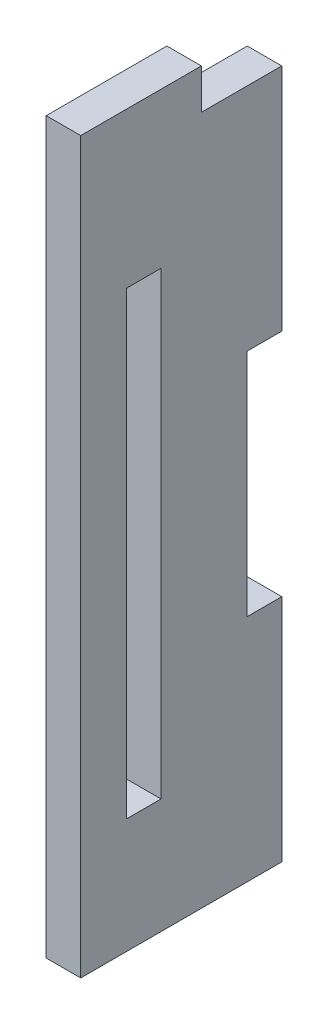
ISO-10303-21;
HEADER;
FILE_DESCRIPTION(('STEP AP214'),'2;1');
FILE_NAME('part.step','',(''),(''),'','','');
FILE_SCHEMA(('AUTOMOTIVE_DESIGN { 1 0 10303 214 1 1 1 1 }'));
ENDSEC;
DATA;
#1=APPLICATION_CONTEXT('core data for automotive mechanical design processes');
#2=APPLICATION_PROTOCOL_DEFINITION('international standard','automotive_design',2000,#1);
#3=PRODUCT_CONTEXT('',#1,'mechanical');
#4=PRODUCT('Part','Part','',(#3));
#5=PRODUCT_RELATED_PRODUCT_CATEGORY('part','',(#4));
#6=PRODUCT_DEFINITION_FORMATION('','',#4);
#7=PRODUCT_DEFINITION_CONTEXT('part definition',#1,'design');
#8=PRODUCT_DEFINITION('design','',#6,#7);
#9=PRODUCT_DEFINITION_SHAPE('','',#8);
#10=(LENGTH_UNIT() NAMED_UNIT(*) SI_UNIT(.MILLI.,.METRE.));
#11=(NAMED_UNIT(*) PLANE_ANGLE_UNIT() SI_UNIT($,.RADIAN.));
#12=(NAMED_UNIT(*) SI_UNIT($,.STERADIAN.) SOLID_ANGLE_UNIT());
#13=UNCERTAINTY_MEASURE_WITH_UNIT(LENGTH_MEASURE(1.E-05),#10,'distance_accuracy_value','');
#14=(GEOMETRIC_REPRESENTATION_CONTEXT(3) GLOBAL_UNCERTAINTY_ASSIGNED_CONTEXT((#13)) GLOBAL_UNIT_ASSIGNED_CONTEXT((#10,
#11,#12)) REPRESENTATION_CONTEXT('',''));
#15=CARTESIAN_POINT('',(0.,0.,0.));
#16=DIRECTION('',(0.,0.,1.));
#17=DIRECTION('',(1.,0.,0.));
#18=AXIS2_PLACEMENT_3D('',#15,#16,#17);
#19=CARTESIAN_POINT('',(6.,120.,0.));
#20=DIRECTION('',(0.,-1.,0.));
#21=DIRECTION('',(0.,0.,-1.));
#22=AXIS2_PLACEMENT_3D('',#19,#20,#21);
#23=PLANE('',#22);
#24=DIRECTION('',(-1.,0.,0.));
#25=VECTOR('',#24,1.);
#26=CARTESIAN_POINT('',(6.,120.,-21.));
#27=LINE('',#26,#25);
#28=CARTESIAN_POINT('',(6.,120.,-21.));
#29=VERTEX_POINT('',#28);
#30=CARTESIAN_POINT('',(0.,120.,-21.));
#31=VERTEX_POINT('',#30);
#32=EDGE_CURVE('E48',#29,#31,#27,.T.);
#33=ORIENTED_EDGE('',*,*,#32,.F.);
#34=DIRECTION('',(0.,0.,1.));
#35=VECTOR('',#34,1.);
#36=CARTESIAN_POINT('',(6.,120.,0.));
#37=LINE('',#36,#35);
#38=CARTESIAN_POINT('',(6.,120.,-35.));
#39=VERTEX_POINT('',#38);
#40=EDGE_CURVE('E144',#39,#29,#37,.T.);
#41=ORIENTED_EDGE('',*,*,#40,.F.);
#42=DIRECTION('',(-1.,0.,0.));
#43=VECTOR('',#42,1.);
#44=CARTESIAN_POINT('',(6.,120.,-35.));
#45=LINE('',#44,#43);
#46=CARTESIAN_POINT('',(0.,120.,-35.));
#47=VERTEX_POINT('',#46);
#48=EDGE_CURVE('E229',#39,#47,#45,.T.);
#49=ORIENTED_EDGE('',*,*,#48,.T.);
#50=DIRECTION('',(0.,0.,1.));
#51=VECTOR('',#50,1.);
#52=CARTESIAN_POINT('',(0.,120.,0.));
#53=LINE('',#52,#51);
#54=EDGE_CURVE('E222',#47,#31,#53,.T.);
#55=ORIENTED_EDGE('',*,*,#54,.T.);
#56=EDGE_LOOP('',(#33,#41,#49,#55));
#57=FACE_BOUND('',#56,.T.);
#58=ADVANCED_FACE('F33',(#57),#23,.F.);
#59=CARTESIAN_POINT('',(6.,0.,0.));
#60=DIRECTION('',(-1.,0.,0.));
#61=DIRECTION('',(0.,0.,1.));
#62=AXIS2_PLACEMENT_3D('',#59,#60,#61);
#63=PLANE('',#62);
#64=DIRECTION('',(0.,0.,1.));
#65=VECTOR('',#64,1.);
#66=CARTESIAN_POINT('',(6.,80.01,-35.));
#67=LINE('',#66,#65);
#68=CARTESIAN_POINT('',(6.,80.01,-35.));
#69=VERTEX_POINT('',#68);
#70=CARTESIAN_POINT('',(6.,80.01,-28.98));
#71=VERTEX_POINT('',#70);
#72=EDGE_CURVE('E195',#69,#71,#67,.T.);
#73=ORIENTED_EDGE('',*,*,#72,.F.);
#74=DIRECTION('',(0.,1.,0.));
#75=VECTOR('',#74,1.);
#76=CARTESIAN_POINT('',(6.,0.,-35.));
#77=LINE('',#76,#75);
#78=EDGE_CURVE('E224',#69,#39,#77,.T.);
#79=ORIENTED_EDGE('',*,*,#78,.T.);
#80=ORIENTED_EDGE('',*,*,#40,.T.);
#81=DIRECTION('',(0.,1.,0.));
#82=VECTOR('',#81,1.);
#83=CARTESIAN_POINT('',(6.,120.,-21.));
#84=LINE('',#83,#82);
#85=CARTESIAN_POINT('',(6.,127.,-21.));
#86=VERTEX_POINT('',#85);
#87=EDGE_CURVE('E135',#29,#86,#84,.T.);
#88=ORIENTED_EDGE('',*,*,#87,.T.);
#89=DIRECTION('',(0.,0.,1.));
#90=VECTOR('',#89,1.);
#91=CARTESIAN_POINT('',(6.,127.,0.));
#92=LINE('',#91,#90);
#93=CARTESIAN_POINT('',(6.,127.,0.));
#94=VERTEX_POINT('',#93);
#95=EDGE_CURVE('E142',#86,#94,#92,.T.);
#96=ORIENTED_EDGE('',*,*,#95,.T.);
#97=DIRECTION('',(0.,-1.,0.));
#98=VECTOR('',#97,1.);
#99=CARTESIAN_POINT('',(6.,0.,0.));
#100=LINE('',#99,#98);
#101=CARTESIAN_POINT('',(6.,0.,0.));
#102=VERTEX_POINT('',#101);
#103=EDGE_CURVE('E219',#94,#102,#100,.T.);
#104=ORIENTED_EDGE('',*,*,#103,.T.);
#105=DIRECTION('',(0.,0.,-1.));
#106=VECTOR('',#105,1.);
#107=CARTESIAN_POINT('',(6.,0.,0.));
#108=LINE('',#107,#106);
#109=CARTESIAN_POINT('',(6.,0.,-35.));
#110=VERTEX_POINT('',#109);
#111=EDGE_CURVE('E221',#102,#110,#108,.T.);
#112=ORIENTED_EDGE('',*,*,#111,.T.);
#113=CARTESIAN_POINT('',(6.,39.99,-35.));
#114=VERTEX_POINT('',#113);
#115=EDGE_CURVE('E225',#110,#114,#77,.T.);
#116=ORIENTED_EDGE('',*,*,#115,.T.);
#117=DIRECTION('',(0.,0.,-1.));
#118=VECTOR('',#117,1.);
#119=CARTESIAN_POINT('',(6.,39.99,-35.));
#120=LINE('',#119,#118);
#121=CARTESIAN_POINT('',(6.,39.99,-28.98));
#122=VERTEX_POINT('',#121);
#123=EDGE_CURVE('E200',#122,#114,#120,.T.);
#124=ORIENTED_EDGE('',*,*,#123,.F.);
#125=DIRECTION('',(0.,-1.,0.));
#126=VECTOR('',#125,1.);
#127=CARTESIAN_POINT('',(6.,39.99,-28.98));
#128=LINE('',#127,#126);
#129=EDGE_CURVE('E197',#71,#122,#128,.T.);
#130=ORIENTED_EDGE('',*,*,#129,.F.);
#131=EDGE_LOOP('',(#73,#79,#80,#88,#96,#104,#112,#116,#124,#130));
#132=FACE_BOUND('',#131,.T.);
#133=DIRECTION('',(0.,-1.,0.));
#134=VECTOR('',#133,1.);
#135=CARTESIAN_POINT('',(6.,0.,-7.93000000000002));
#136=LINE('',#135,#134);
#137=CARTESIAN_POINT('',(6.,100.,-7.93000000000002));
#138=VERTEX_POINT('',#137);
#139=CARTESIAN_POINT('',(6.,20.,-7.93000000000002));
#140=VERTEX_POINT('',#139);
#141=EDGE_CURVE('E192',#138,#140,#136,.T.);
#142=ORIENTED_EDGE('',*,*,#141,.F.);
#143=DIRECTION('',(0.,0.,1.));
#144=VECTOR('',#143,1.);
#145=CARTESIAN_POINT('',(6.,100.,0.));
#146=LINE('',#145,#144);
#147=CARTESIAN_POINT('',(6.,100.,-13.98));
#148=VERTEX_POINT('',#147);
#149=EDGE_CURVE('E186',#148,#138,#146,.T.);
#150=ORIENTED_EDGE('',*,*,#149,.F.);
#151=DIRECTION('',(0.,1.,0.));
#152=VECTOR('',#151,1.);
#153=CARTESIAN_POINT('',(6.,0.,-13.98));
#154=LINE('',#153,#152);
#155=CARTESIAN_POINT('',(6.,20.,-13.98));
#156=VERTEX_POINT('',#155);
#157=EDGE_CURVE('E188',#156,#148,#154,.T.);
#158=ORIENTED_EDGE('',*,*,#157,.F.);
#159=DIRECTION('',(0.,0.,-1.));
#160=VECTOR('',#159,1.);
#161=CARTESIAN_POINT('',(6.,20.,0.));
#162=LINE('',#161,#160);
#163=EDGE_CURVE('E190',#140,#156,#162,.T.);
#164=ORIENTED_EDGE('',*,*,#163,.F.);
#165=EDGE_LOOP('',(#142,#150,#158,#164));
#166=FACE_BOUND('',#165,.T.);
#167=ADVANCED_FACE('F138',(#132,#166),#63,.F.);
#168=CARTESIAN_POINT('',(0.,0.,0.));
#169=DIRECTION('',(-1.,0.,0.));
#170=DIRECTION('',(0.,0.,1.));
#171=AXIS2_PLACEMENT_3D('',#168,#169,#170);
#172=PLANE('',#171);
#173=DIRECTION('',(0.,1.,0.));
#174=VECTOR('',#173,1.);
#175=CARTESIAN_POINT('',(0.,0.,-35.));
#176=LINE('',#175,#174);
#177=CARTESIAN_POINT('',(0.,80.01,-35.));
#178=VERTEX_POINT('',#177);
#179=EDGE_CURVE('E234',#178,#47,#176,.T.);
#180=ORIENTED_EDGE('',*,*,#179,.F.);
#181=DIRECTION('',(0.,0.,1.));
#182=VECTOR('',#181,1.);
#183=CARTESIAN_POINT('',(0.,80.01,-35.));
#184=LINE('',#183,#182);
#185=CARTESIAN_POINT('',(0.,80.01,-28.98));
#186=VERTEX_POINT('',#185);
#187=EDGE_CURVE('E194',#178,#186,#184,.T.);
#188=ORIENTED_EDGE('',*,*,#187,.T.);
#189=DIRECTION('',(0.,-1.,0.));
#190=VECTOR('',#189,1.);
#191=CARTESIAN_POINT('',(0.,39.99,-28.98));
#192=LINE('',#191,#190);
#193=CARTESIAN_POINT('',(0.,39.99,-28.98));
#194=VERTEX_POINT('',#193);
#195=EDGE_CURVE('E205',#186,#194,#192,.T.);
#196=ORIENTED_EDGE('',*,*,#195,.T.);
#197=DIRECTION('',(0.,0.,-1.));
#198=VECTOR('',#197,1.);
#199=CARTESIAN_POINT('',(0.,39.99,-35.));
#200=LINE('',#199,#198);
#201=CARTESIAN_POINT('',(0.,39.99,-35.));
#202=VERTEX_POINT('',#201);
#203=EDGE_CURVE('E198',#194,#202,#200,.T.);
#204=ORIENTED_EDGE('',*,*,#203,.T.);
#205=CARTESIAN_POINT('',(0.,0.,-35.));
#206=VERTEX_POINT('',#205);
#207=EDGE_CURVE('E235',#206,#202,#176,.T.);
#208=ORIENTED_EDGE('',*,*,#207,.F.);
#209=DIRECTION('',(0.,0.,-1.));
#210=VECTOR('',#209,1.);
#211=CARTESIAN_POINT('',(0.,0.,0.));
#212=LINE('',#211,#210);
#213=CARTESIAN_POINT('',(0.,0.,0.));
#214=VERTEX_POINT('',#213);
#215=EDGE_CURVE('E232',#214,#206,#212,.T.);
#216=ORIENTED_EDGE('',*,*,#215,.F.);
#217=DIRECTION('',(0.,-1.,0.));
#218=VECTOR('',#217,1.);
#219=CARTESIAN_POINT('',(0.,0.,0.));
#220=LINE('',#219,#218);
#221=CARTESIAN_POINT('',(0.,127.,0.));
#222=VERTEX_POINT('',#221);
#223=EDGE_CURVE('E218',#222,#214,#220,.T.);
#224=ORIENTED_EDGE('',*,*,#223,.F.);
#225=DIRECTION('',(0.,0.,1.));
#226=VECTOR('',#225,1.);
#227=CARTESIAN_POINT('',(0.,127.,0.));
#228=LINE('',#227,#226);
#229=CARTESIAN_POINT('',(0.,127.,-21.));
#230=VERTEX_POINT('',#229);
#231=EDGE_CURVE('E146',#230,#222,#228,.T.);
#232=ORIENTED_EDGE('',*,*,#231,.F.);
#233=DIRECTION('',(0.,1.,0.));
#234=VECTOR('',#233,1.);
#235=CARTESIAN_POINT('',(0.,120.,-21.));
#236=LINE('',#235,#234);
#237=EDGE_CURVE('E152',#31,#230,#236,.T.);
#238=ORIENTED_EDGE('',*,*,#237,.F.);
#239=ORIENTED_EDGE('',*,*,#54,.F.);
#240=EDGE_LOOP('',(#180,#188,#196,#204,#208,#216,#224,#232,#238,#239));
#241=FACE_BOUND('',#240,.T.);
#242=DIRECTION('',(0.,0.,1.));
#243=VECTOR('',#242,1.);
#244=CARTESIAN_POINT('',(0.,100.,-7.93000000000002));
#245=LINE('',#244,#243);
#246=CARTESIAN_POINT('',(0.,100.,-13.98));
#247=VERTEX_POINT('',#246);
#248=CARTESIAN_POINT('',(0.,100.,-7.93000000000002));
#249=VERTEX_POINT('',#248);
#250=EDGE_CURVE('E175',#247,#249,#245,.T.);
#251=ORIENTED_EDGE('',*,*,#250,.T.);
#252=DIRECTION('',(0.,-1.,0.));
#253=VECTOR('',#252,1.);
#254=CARTESIAN_POINT('',(0.,100.,-7.93000000000002));
#255=LINE('',#254,#253);
#256=CARTESIAN_POINT('',(0.,20.,-7.93000000000002));
#257=VERTEX_POINT('',#256);
#258=EDGE_CURVE('E166',#249,#257,#255,.T.);
#259=ORIENTED_EDGE('',*,*,#258,.T.);
#260=DIRECTION('',(0.,0.,-1.));
#261=VECTOR('',#260,1.);
#262=CARTESIAN_POINT('',(0.,20.,-7.93000000000002));
#263=LINE('',#262,#261);
#264=CARTESIAN_POINT('',(0.,20.,-13.98));
#265=VERTEX_POINT('',#264);
#266=EDGE_CURVE('E169',#257,#265,#263,.T.);
#267=ORIENTED_EDGE('',*,*,#266,.T.);
#268=DIRECTION('',(0.,1.,0.));
#269=VECTOR('',#268,1.);
#270=CARTESIAN_POINT('',(0.,100.,-13.98));
#271=LINE('',#270,#269);
#272=EDGE_CURVE('E172',#265,#247,#271,.T.);
#273=ORIENTED_EDGE('',*,*,#272,.T.);
#274=EDGE_LOOP('',(#251,#259,#267,#273));
#275=FACE_BOUND('',#274,.T.);
#276=ADVANCED_FACE('F250',(#241,#275),#172,.T.);
#277=CARTESIAN_POINT('',(6.,0.,-35.));
#278=DIRECTION('',(0.,0.,1.));
#279=DIRECTION('',(1.,0.,0.));
#280=AXIS2_PLACEMENT_3D('',#277,#278,#279);
#281=PLANE('',#280);
#282=DIRECTION('',(-1.,0.,0.));
#283=VECTOR('',#282,1.);
#284=CARTESIAN_POINT('',(6.,80.01,-35.));
#285=LINE('',#284,#283);
#286=EDGE_CURVE('E215',#69,#178,#285,.T.);
#287=ORIENTED_EDGE('',*,*,#286,.T.);
#288=ORIENTED_EDGE('',*,*,#179,.T.);
#289=ORIENTED_EDGE('',*,*,#48,.F.);
#290=ORIENTED_EDGE('',*,*,#78,.F.);
#291=EDGE_LOOP('',(#287,#288,#289,#290));
#292=FACE_BOUND('',#291,.T.);
#293=ADVANCED_FACE('F266',(#292),#281,.F.);
#294=DIRECTION('',(-1.,0.,0.));
#295=VECTOR('',#294,1.);
#296=CARTESIAN_POINT('',(6.,39.99,-35.));
#297=LINE('',#296,#295);
#298=EDGE_CURVE('E202',#114,#202,#297,.T.);
#299=ORIENTED_EDGE('',*,*,#298,.F.);
#300=ORIENTED_EDGE('',*,*,#115,.F.);
#301=DIRECTION('',(-1.,0.,0.));
#302=VECTOR('',#301,1.);
#303=CARTESIAN_POINT('',(6.,0.,-35.));
#304=LINE('',#303,#302);
#305=EDGE_CURVE('E41',#110,#206,#304,.T.);
#306=ORIENTED_EDGE('',*,*,#305,.T.);
#307=ORIENTED_EDGE('',*,*,#207,.T.);
#308=EDGE_LOOP('',(#299,#300,#306,#307));
#309=FACE_BOUND('',#308,.T.);
#310=ADVANCED_FACE('F246',(#309),#281,.F.);
#311=CARTESIAN_POINT('',(6.,0.,0.));
#312=DIRECTION('',(0.,0.,-1.));
#313=DIRECTION('',(-1.,0.,0.));
#314=AXIS2_PLACEMENT_3D('',#311,#312,#313);
#315=PLANE('',#314);
#316=ORIENTED_EDGE('',*,*,#223,.T.);
#317=DIRECTION('',(-1.,0.,0.));
#318=VECTOR('',#317,1.);
#319=CARTESIAN_POINT('',(6.,0.,0.));
#320=LINE('',#319,#318);
#321=EDGE_CURVE('E11',#102,#214,#320,.T.);
#322=ORIENTED_EDGE('',*,*,#321,.F.);
#323=ORIENTED_EDGE('',*,*,#103,.F.);
#324=DIRECTION('',(-1.,0.,0.));
#325=VECTOR('',#324,1.);
#326=CARTESIAN_POINT('',(6.,127.,0.));
#327=LINE('',#326,#325);
#328=EDGE_CURVE('E156',#94,#222,#327,.T.);
#329=ORIENTED_EDGE('',*,*,#328,.T.);
#330=EDGE_LOOP('',(#316,#322,#323,#329));
#331=FACE_BOUND('',#330,.T.);
#332=ADVANCED_FACE('F35',(#331),#315,.F.);
#333=CARTESIAN_POINT('',(6.,0.,0.));
#334=DIRECTION('',(0.,1.,0.));
#335=DIRECTION('',(0.,0.,1.));
#336=AXIS2_PLACEMENT_3D('',#333,#334,#335);
#337=PLANE('',#336);
#338=ORIENTED_EDGE('',*,*,#215,.T.);
#339=ORIENTED_EDGE('',*,*,#305,.F.);
#340=ORIENTED_EDGE('',*,*,#111,.F.);
#341=ORIENTED_EDGE('',*,*,#321,.T.);
#342=EDGE_LOOP('',(#338,#339,#340,#341));
#343=FACE_BOUND('',#342,.T.);
#344=ADVANCED_FACE('F260',(#343),#337,.F.);
#345=CARTESIAN_POINT('',(6.,80.01,-35.));
#346=DIRECTION('',(0.,-1.,0.));
#347=DIRECTION('',(0.,0.,-1.));
#348=AXIS2_PLACEMENT_3D('',#345,#346,#347);
#349=PLANE('',#348);
#350=ORIENTED_EDGE('',*,*,#187,.F.);
#351=ORIENTED_EDGE('',*,*,#286,.F.);
#352=ORIENTED_EDGE('',*,*,#72,.T.);
#353=DIRECTION('',(-1.,0.,0.));
#354=VECTOR('',#353,1.);
#355=CARTESIAN_POINT('',(6.,80.01,-28.98));
#356=LINE('',#355,#354);
#357=EDGE_CURVE('E213',#71,#186,#356,.T.);
#358=ORIENTED_EDGE('',*,*,#357,.T.);
#359=EDGE_LOOP('',(#350,#351,#352,#358));
#360=FACE_BOUND('',#359,.T.);
#361=ADVANCED_FACE('F268',(#360),#349,.T.);
#362=CARTESIAN_POINT('',(6.,39.99,-28.98));
#363=DIRECTION('',(0.,0.,-1.));
#364=DIRECTION('',(-1.,0.,0.));
#365=AXIS2_PLACEMENT_3D('',#362,#363,#364);
#366=PLANE('',#365);
#367=ORIENTED_EDGE('',*,*,#195,.F.);
#368=ORIENTED_EDGE('',*,*,#357,.F.);
#369=ORIENTED_EDGE('',*,*,#129,.T.);
#370=DIRECTION('',(-1.,0.,0.));
#371=VECTOR('',#370,1.);
#372=CARTESIAN_POINT('',(6.,39.99,-28.98));
#373=LINE('',#372,#371);
#374=EDGE_CURVE('E211',#122,#194,#373,.T.);
#375=ORIENTED_EDGE('',*,*,#374,.T.);
#376=EDGE_LOOP('',(#367,#368,#369,#375));
#377=FACE_BOUND('',#376,.T.);
#378=ADVANCED_FACE('F271',(#377),#366,.T.);
#379=CARTESIAN_POINT('',(6.,39.99,-35.));
#380=DIRECTION('',(0.,1.,0.));
#381=DIRECTION('',(0.,0.,1.));
#382=AXIS2_PLACEMENT_3D('',#379,#380,#381);
#383=PLANE('',#382);
#384=ORIENTED_EDGE('',*,*,#203,.F.);
#385=ORIENTED_EDGE('',*,*,#374,.F.);
#386=ORIENTED_EDGE('',*,*,#123,.T.);
#387=ORIENTED_EDGE('',*,*,#298,.T.);
#388=EDGE_LOOP('',(#384,#385,#386,#387));
#389=FACE_BOUND('',#388,.T.);
#390=ADVANCED_FACE('F256',(#389),#383,.T.);
#391=CARTESIAN_POINT('',(10.,100.,-7.93000000000002));
#392=DIRECTION('',(0.,0.,-1.));
#393=DIRECTION('',(-1.,0.,0.));
#394=AXIS2_PLACEMENT_3D('',#391,#392,#393);
#395=PLANE('',#394);
#396=ORIENTED_EDGE('',*,*,#141,.T.);
#397=DIRECTION('',(-1.,0.,0.));
#398=VECTOR('',#397,1.);
#399=CARTESIAN_POINT('',(10.,20.,-7.93000000000002));
#400=LINE('',#399,#398);
#401=EDGE_CURVE('E184',#140,#257,#400,.T.);
#402=ORIENTED_EDGE('',*,*,#401,.T.);
#403=ORIENTED_EDGE('',*,*,#258,.F.);
#404=DIRECTION('',(-1.,0.,0.));
#405=VECTOR('',#404,1.);
#406=CARTESIAN_POINT('',(10.,100.,-7.93000000000002));
#407=LINE('',#406,#405);
#408=EDGE_CURVE('E178',#138,#249,#407,.T.);
#409=ORIENTED_EDGE('',*,*,#408,.F.);
#410=EDGE_LOOP('',(#396,#402,#403,#409));
#411=FACE_BOUND('',#410,.T.);
#412=ADVANCED_FACE('F278',(#411),#395,.T.);
#413=CARTESIAN_POINT('',(10.,20.,-7.93000000000002));
#414=DIRECTION('',(0.,1.,0.));
#415=DIRECTION('',(0.,0.,1.));
#416=AXIS2_PLACEMENT_3D('',#413,#414,#415);
#417=PLANE('',#416);
#418=ORIENTED_EDGE('',*,*,#163,.T.);
#419=DIRECTION('',(-1.,0.,0.));
#420=VECTOR('',#419,1.);
#421=CARTESIAN_POINT('',(10.,20.,-13.98));
#422=LINE('',#421,#420);
#423=EDGE_CURVE('E182',#156,#265,#422,.T.);
#424=ORIENTED_EDGE('',*,*,#423,.T.);
#425=ORIENTED_EDGE('',*,*,#266,.F.);
#426=ORIENTED_EDGE('',*,*,#401,.F.);
#427=EDGE_LOOP('',(#418,#424,#425,#426));
#428=FACE_BOUND('',#427,.T.);
#429=ADVANCED_FACE('F354',(#428),#417,.T.);
#430=CARTESIAN_POINT('',(10.,100.,-13.98));
#431=DIRECTION('',(0.,0.,1.));
#432=DIRECTION('',(1.,0.,0.));
#433=AXIS2_PLACEMENT_3D('',#430,#431,#432);
#434=PLANE('',#433);
#435=ORIENTED_EDGE('',*,*,#157,.T.);
#436=DIRECTION('',(-1.,0.,0.));
#437=VECTOR('',#436,1.);
#438=CARTESIAN_POINT('',(10.,100.,-13.98));
#439=LINE('',#438,#437);
#440=EDGE_CURVE('E56',#148,#247,#439,.T.);
#441=ORIENTED_EDGE('',*,*,#440,.T.);
#442=ORIENTED_EDGE('',*,*,#272,.F.);
#443=ORIENTED_EDGE('',*,*,#423,.F.);
#444=EDGE_LOOP('',(#435,#441,#442,#443));
#445=FACE_BOUND('',#444,.T.);
#446=ADVANCED_FACE('F351',(#445),#434,.T.);
#447=CARTESIAN_POINT('',(10.,100.,-7.93000000000002));
#448=DIRECTION('',(0.,-1.,0.));
#449=DIRECTION('',(0.,0.,-1.));
#450=AXIS2_PLACEMENT_3D('',#447,#448,#449);
#451=PLANE('',#450);
#452=ORIENTED_EDGE('',*,*,#149,.T.);
#453=ORIENTED_EDGE('',*,*,#408,.T.);
#454=ORIENTED_EDGE('',*,*,#250,.F.);
#455=ORIENTED_EDGE('',*,*,#440,.F.);
#456=EDGE_LOOP('',(#452,#453,#454,#455));
#457=FACE_BOUND('',#456,.T.);
#458=ADVANCED_FACE('F337',(#457),#451,.T.);
#459=CARTESIAN_POINT('',(6.,120.,-21.));
#460=DIRECTION('',(0.,0.,1.));
#461=DIRECTION('',(1.,0.,0.));
#462=AXIS2_PLACEMENT_3D('',#459,#460,#461);
#463=PLANE('',#462);
#464=ORIENTED_EDGE('',*,*,#237,.T.);
#465=DIRECTION('',(-1.,0.,0.));
#466=VECTOR('',#465,1.);
#467=CARTESIAN_POINT('',(6.,127.,-21.));
#468=LINE('',#467,#466);
#469=EDGE_CURVE('E149',#86,#230,#468,.T.);
#470=ORIENTED_EDGE('',*,*,#469,.F.);
#471=ORIENTED_EDGE('',*,*,#87,.F.);
#472=ORIENTED_EDGE('',*,*,#32,.T.);
#473=EDGE_LOOP('',(#464,#470,#471,#472));
#474=FACE_BOUND('',#473,.T.);
#475=ADVANCED_FACE('F150',(#474),#463,.F.);
#476=CARTESIAN_POINT('',(6.,127.,0.));
#477=DIRECTION('',(0.,-1.,0.));
#478=DIRECTION('',(0.,0.,-1.));
#479=AXIS2_PLACEMENT_3D('',#476,#477,#478);
#480=PLANE('',#479);
#481=ORIENTED_EDGE('',*,*,#231,.T.);
#482=ORIENTED_EDGE('',*,*,#328,.F.);
#483=ORIENTED_EDGE('',*,*,#95,.F.);
#484=ORIENTED_EDGE('',*,*,#469,.T.);
#485=EDGE_LOOP('',(#481,#482,#483,#484));
#486=FACE_BOUND('',#485,.T.);
#487=ADVANCED_FACE('F158',(#486),#480,.F.);
#488=CLOSED_SHELL('',(#58,#167,#276,#293,#310,#332,#344,#361,#378,#390,#412,#429,#446,#458,#475,#487));
#489=MANIFOLD_SOLID_BREP('B2',#488);
#490=ADVANCED_BREP_SHAPE_REPRESENTATION('',(#18,#489),#14);
#491=SHAPE_DEFINITION_REPRESENTATION(#9,#490);
ENDSEC;
END-ISO-10303-21;
